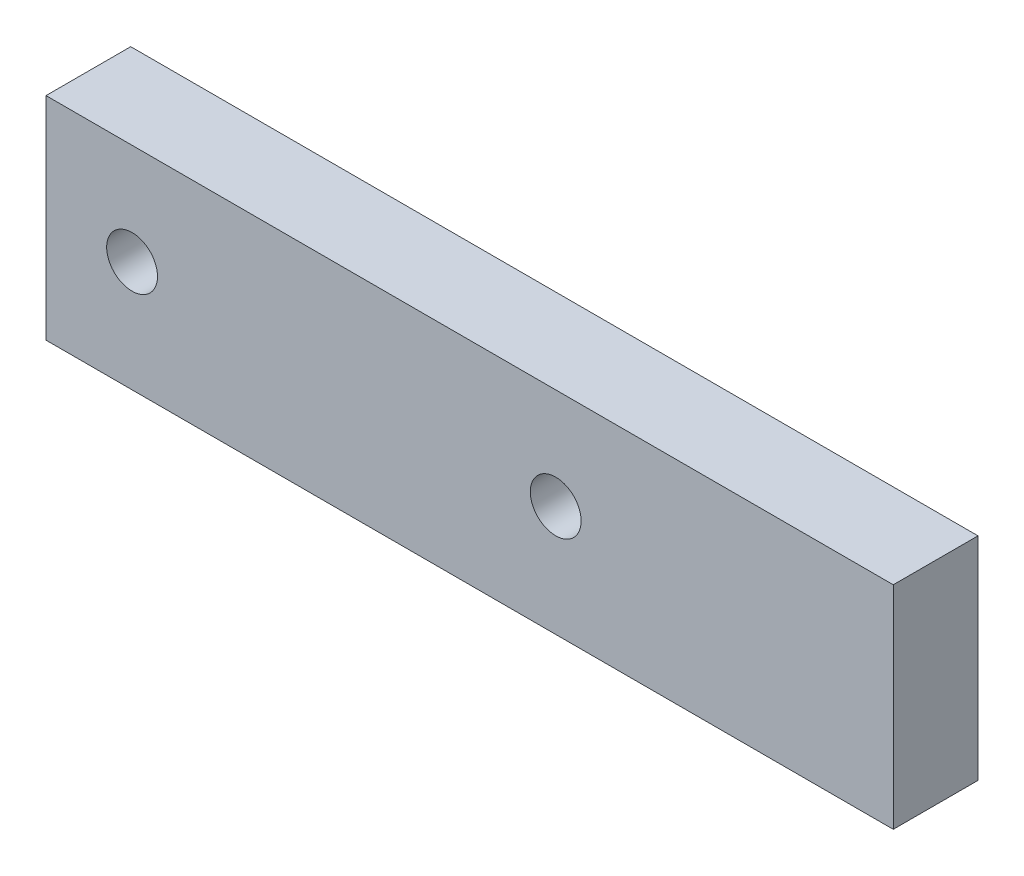
ISO-10303-21;
HEADER;
FILE_DESCRIPTION(('STEP AP214'),'2;1');
FILE_NAME('part.step','',(''),(''),'','','');
FILE_SCHEMA(('AUTOMOTIVE_DESIGN { 1 0 10303 214 1 1 1 1 }'));
ENDSEC;
DATA;
#1=APPLICATION_CONTEXT('core data for automotive mechanical design processes');
#2=APPLICATION_PROTOCOL_DEFINITION('international standard','automotive_design',2000,#1);
#3=PRODUCT_CONTEXT('',#1,'mechanical');
#4=PRODUCT('Part','Part','',(#3));
#5=PRODUCT_RELATED_PRODUCT_CATEGORY('part','',(#4));
#6=PRODUCT_DEFINITION_FORMATION('','',#4);
#7=PRODUCT_DEFINITION_CONTEXT('part definition',#1,'design');
#8=PRODUCT_DEFINITION('design','',#6,#7);
#9=PRODUCT_DEFINITION_SHAPE('','',#8);
#10=(LENGTH_UNIT() NAMED_UNIT(*) SI_UNIT(.MILLI.,.METRE.));
#11=(NAMED_UNIT(*) PLANE_ANGLE_UNIT() SI_UNIT($,.RADIAN.));
#12=(NAMED_UNIT(*) SI_UNIT($,.STERADIAN.) SOLID_ANGLE_UNIT());
#13=UNCERTAINTY_MEASURE_WITH_UNIT(LENGTH_MEASURE(1.E-05),#10,'distance_accuracy_value','');
#14=(GEOMETRIC_REPRESENTATION_CONTEXT(3) GLOBAL_UNCERTAINTY_ASSIGNED_CONTEXT((#13)) GLOBAL_UNIT_ASSIGNED_CONTEXT((#10,
#11,#12)) REPRESENTATION_CONTEXT('',''));
#15=CARTESIAN_POINT('',(0.,0.,0.));
#16=DIRECTION('',(0.,0.,1.));
#17=DIRECTION('',(1.,0.,0.));
#18=AXIS2_PLACEMENT_3D('',#15,#16,#17);
#19=CARTESIAN_POINT('',(-37.6595744680851,11.9148936170213,10.));
#20=DIRECTION('',(1.,0.,0.));
#21=DIRECTION('',(0.,0.,-1.));
#22=AXIS2_PLACEMENT_3D('',#19,#20,#21);
#23=PLANE('',#22);
#24=DIRECTION('',(0.,-1.,0.));
#25=VECTOR('',#24,1.);
#26=CARTESIAN_POINT('',(-37.6595744680851,11.9148936170213,0.));
#27=LINE('',#26,#25);
#28=CARTESIAN_POINT('',(-37.6595744680851,11.9148936170213,0.));
#29=VERTEX_POINT('',#28);
#30=CARTESIAN_POINT('',(-37.6595744680851,-13.0851063829787,0.));
#31=VERTEX_POINT('',#30);
#32=EDGE_CURVE('E100',#29,#31,#27,.T.);
#33=ORIENTED_EDGE('',*,*,#32,.T.);
#34=DIRECTION('',(0.,0.,-1.));
#35=VECTOR('',#34,1.);
#36=CARTESIAN_POINT('',(-37.6595744680851,-13.0851063829787,10.));
#37=LINE('',#36,#35);
#38=CARTESIAN_POINT('',(-37.6595744680851,-13.0851063829787,10.));
#39=VERTEX_POINT('',#38);
#40=EDGE_CURVE('E11',#39,#31,#37,.T.);
#41=ORIENTED_EDGE('',*,*,#40,.F.);
#42=DIRECTION('',(0.,-1.,0.));
#43=VECTOR('',#42,1.);
#44=CARTESIAN_POINT('',(-37.6595744680851,11.9148936170213,10.));
#45=LINE('',#44,#43);
#46=CARTESIAN_POINT('',(-37.6595744680851,11.9148936170213,10.));
#47=VERTEX_POINT('',#46);
#48=EDGE_CURVE('E88',#47,#39,#45,.T.);
#49=ORIENTED_EDGE('',*,*,#48,.F.);
#50=DIRECTION('',(0.,0.,-1.));
#51=VECTOR('',#50,1.);
#52=CARTESIAN_POINT('',(-37.6595744680851,11.9148936170213,10.));
#53=LINE('',#52,#51);
#54=EDGE_CURVE('E96',#47,#29,#53,.T.);
#55=ORIENTED_EDGE('',*,*,#54,.T.);
#56=EDGE_LOOP('',(#33,#41,#49,#55));
#57=FACE_BOUND('',#56,.T.);
#58=ADVANCED_FACE('F37',(#57),#23,.F.);
#59=CARTESIAN_POINT('',(-37.6595744680851,-13.0851063829787,10.));
#60=DIRECTION('',(0.,1.,0.));
#61=DIRECTION('',(0.,0.,1.));
#62=AXIS2_PLACEMENT_3D('',#59,#60,#61);
#63=PLANE('',#62);
#64=DIRECTION('',(1.,0.,0.));
#65=VECTOR('',#64,1.);
#66=CARTESIAN_POINT('',(-37.6595744680851,-13.0851063829787,0.));
#67=LINE('',#66,#65);
#68=CARTESIAN_POINT('',(62.3404255319149,-13.0851063829787,0.));
#69=VERTEX_POINT('',#68);
#70=EDGE_CURVE('E92',#31,#69,#67,.T.);
#71=ORIENTED_EDGE('',*,*,#70,.T.);
#72=DIRECTION('',(0.,0.,-1.));
#73=VECTOR('',#72,1.);
#74=CARTESIAN_POINT('',(62.3404255319149,-13.0851063829787,10.));
#75=LINE('',#74,#73);
#76=CARTESIAN_POINT('',(62.3404255319149,-13.0851063829787,10.));
#77=VERTEX_POINT('',#76);
#78=EDGE_CURVE('E45',#77,#69,#75,.T.);
#79=ORIENTED_EDGE('',*,*,#78,.F.);
#80=DIRECTION('',(1.,0.,0.));
#81=VECTOR('',#80,1.);
#82=CARTESIAN_POINT('',(-37.6595744680851,-13.0851063829787,10.));
#83=LINE('',#82,#81);
#84=EDGE_CURVE('E83',#39,#77,#83,.T.);
#85=ORIENTED_EDGE('',*,*,#84,.F.);
#86=ORIENTED_EDGE('',*,*,#40,.T.);
#87=EDGE_LOOP('',(#71,#79,#85,#86));
#88=FACE_BOUND('',#87,.T.);
#89=ADVANCED_FACE('F91',(#88),#63,.F.);
#90=CARTESIAN_POINT('',(62.3404255319149,11.9148936170213,10.));
#91=DIRECTION('',(-1.,0.,0.));
#92=DIRECTION('',(0.,0.,1.));
#93=AXIS2_PLACEMENT_3D('',#90,#91,#92);
#94=PLANE('',#93);
#95=DIRECTION('',(0.,1.,0.));
#96=VECTOR('',#95,1.);
#97=CARTESIAN_POINT('',(62.3404255319149,11.9148936170213,0.));
#98=LINE('',#97,#96);
#99=CARTESIAN_POINT('',(62.3404255319149,11.9148936170213,0.));
#100=VERTEX_POINT('',#99);
#101=EDGE_CURVE('E70',#69,#100,#98,.T.);
#102=ORIENTED_EDGE('',*,*,#101,.T.);
#103=DIRECTION('',(0.,0.,-1.));
#104=VECTOR('',#103,1.);
#105=CARTESIAN_POINT('',(62.3404255319149,11.9148936170213,10.));
#106=LINE('',#105,#104);
#107=CARTESIAN_POINT('',(62.3404255319149,11.9148936170213,10.));
#108=VERTEX_POINT('',#107);
#109=EDGE_CURVE('E93',#108,#100,#106,.T.);
#110=ORIENTED_EDGE('',*,*,#109,.F.);
#111=DIRECTION('',(0.,1.,0.));
#112=VECTOR('',#111,1.);
#113=CARTESIAN_POINT('',(62.3404255319149,11.9148936170213,10.));
#114=LINE('',#113,#112);
#115=EDGE_CURVE('E86',#77,#108,#114,.T.);
#116=ORIENTED_EDGE('',*,*,#115,.F.);
#117=ORIENTED_EDGE('',*,*,#78,.T.);
#118=EDGE_LOOP('',(#102,#110,#116,#117));
#119=FACE_BOUND('',#118,.T.);
#120=ADVANCED_FACE('F94',(#119),#94,.F.);
#121=CARTESIAN_POINT('',(-37.6595744680851,11.9148936170213,10.));
#122=DIRECTION('',(0.,-1.,0.));
#123=DIRECTION('',(0.,0.,-1.));
#124=AXIS2_PLACEMENT_3D('',#121,#122,#123);
#125=PLANE('',#124);
#126=DIRECTION('',(-1.,0.,0.));
#127=VECTOR('',#126,1.);
#128=CARTESIAN_POINT('',(-37.6595744680851,11.9148936170213,0.));
#129=LINE('',#128,#127);
#130=EDGE_CURVE('E76',#100,#29,#129,.T.);
#131=ORIENTED_EDGE('',*,*,#130,.T.);
#132=ORIENTED_EDGE('',*,*,#54,.F.);
#133=DIRECTION('',(-1.,0.,0.));
#134=VECTOR('',#133,1.);
#135=CARTESIAN_POINT('',(-37.6595744680851,11.9148936170213,10.));
#136=LINE('',#135,#134);
#137=EDGE_CURVE('E53',#108,#47,#136,.T.);
#138=ORIENTED_EDGE('',*,*,#137,.F.);
#139=ORIENTED_EDGE('',*,*,#109,.T.);
#140=EDGE_LOOP('',(#131,#132,#138,#139));
#141=FACE_BOUND('',#140,.T.);
#142=ADVANCED_FACE('F108',(#141),#125,.F.);
#143=CARTESIAN_POINT('',(0.,0.,10.));
#144=DIRECTION('',(0.,0.,1.));
#145=DIRECTION('',(1.,0.,0.));
#146=AXIS2_PLACEMENT_3D('',#143,#144,#145);
#147=PLANE('',#146);
#148=CARTESIAN_POINT('',(22.4995853148409,0.,10.));
#149=DIRECTION('',(0.,0.,1.));
#150=DIRECTION('',(1.,0.,0.));
#151=AXIS2_PLACEMENT_3D('',#148,#149,#150);
#152=CIRCLE('',#151,3.);
#153=CARTESIAN_POINT('',(25.4995853148409,0.,10.));
#154=VERTEX_POINT('',#153);
#155=EDGE_CURVE('E120',#154,#154,#152,.T.);
#156=ORIENTED_EDGE('',*,*,#155,.F.);
#157=EDGE_LOOP('',(#156));
#158=FACE_BOUND('',#157,.T.);
#159=CARTESIAN_POINT('',(-27.5004146851591,0.,10.));
#160=DIRECTION('',(0.,0.,1.));
#161=DIRECTION('',(1.,0.,0.));
#162=AXIS2_PLACEMENT_3D('',#159,#160,#161);
#163=CIRCLE('',#162,3.);
#164=CARTESIAN_POINT('',(-24.5004146851591,0.,10.));
#165=VERTEX_POINT('',#164);
#166=EDGE_CURVE('E114',#165,#165,#163,.T.);
#167=ORIENTED_EDGE('',*,*,#166,.F.);
#168=EDGE_LOOP('',(#167));
#169=FACE_BOUND('',#168,.T.);
#170=ORIENTED_EDGE('',*,*,#48,.T.);
#171=ORIENTED_EDGE('',*,*,#84,.T.);
#172=ORIENTED_EDGE('',*,*,#115,.T.);
#173=ORIENTED_EDGE('',*,*,#137,.T.);
#174=EDGE_LOOP('',(#170,#171,#172,#173));
#175=FACE_BOUND('',#174,.T.);
#176=ADVANCED_FACE('F84',(#158,#169,#175),#147,.T.);
#177=CARTESIAN_POINT('',(0.,0.,0.));
#178=DIRECTION('',(0.,0.,1.));
#179=DIRECTION('',(1.,0.,0.));
#180=AXIS2_PLACEMENT_3D('',#177,#178,#179);
#181=PLANE('',#180);
#182=CARTESIAN_POINT('',(22.4995853148409,0.,0.));
#183=DIRECTION('',(0.,0.,1.));
#184=DIRECTION('',(1.,0.,0.));
#185=AXIS2_PLACEMENT_3D('',#182,#183,#184);
#186=CIRCLE('',#185,3.);
#187=CARTESIAN_POINT('',(25.4995853148409,0.,0.));
#188=VERTEX_POINT('',#187);
#189=EDGE_CURVE('E117',#188,#188,#186,.T.);
#190=ORIENTED_EDGE('',*,*,#189,.T.);
#191=EDGE_LOOP('',(#190));
#192=FACE_BOUND('',#191,.T.);
#193=CARTESIAN_POINT('',(-27.5004146851591,0.,0.));
#194=DIRECTION('',(0.,0.,1.));
#195=DIRECTION('',(1.,0.,0.));
#196=AXIS2_PLACEMENT_3D('',#193,#194,#195);
#197=CIRCLE('',#196,3.);
#198=CARTESIAN_POINT('',(-24.5004146851591,0.,0.));
#199=VERTEX_POINT('',#198);
#200=EDGE_CURVE('E103',#199,#199,#197,.T.);
#201=ORIENTED_EDGE('',*,*,#200,.T.);
#202=EDGE_LOOP('',(#201));
#203=FACE_BOUND('',#202,.T.);
#204=ORIENTED_EDGE('',*,*,#32,.F.);
#205=ORIENTED_EDGE('',*,*,#130,.F.);
#206=ORIENTED_EDGE('',*,*,#101,.F.);
#207=ORIENTED_EDGE('',*,*,#70,.F.);
#208=EDGE_LOOP('',(#204,#205,#206,#207));
#209=FACE_BOUND('',#208,.T.);
#210=ADVANCED_FACE('F111',(#192,#203,#209),#181,.F.);
#211=CARTESIAN_POINT('',(-27.5004146851591,0.,0.));
#212=DIRECTION('',(0.,0.,1.));
#213=DIRECTION('',(1.,0.,0.));
#214=AXIS2_PLACEMENT_3D('',#211,#212,#213);
#215=CYLINDRICAL_SURFACE('',#214,3.);
#216=ORIENTED_EDGE('',*,*,#200,.F.);
#217=EDGE_LOOP('',(#216));
#218=FACE_BOUND('',#217,.T.);
#219=ORIENTED_EDGE('',*,*,#166,.T.);
#220=EDGE_LOOP('',(#219));
#221=FACE_BOUND('',#220,.T.);
#222=ADVANCED_FACE('F131',(#218,#221),#215,.F.);
#223=CARTESIAN_POINT('',(22.4995853148409,0.,0.));
#224=DIRECTION('',(0.,0.,1.));
#225=DIRECTION('',(1.,0.,0.));
#226=AXIS2_PLACEMENT_3D('',#223,#224,#225);
#227=CYLINDRICAL_SURFACE('',#226,3.);
#228=ORIENTED_EDGE('',*,*,#189,.F.);
#229=EDGE_LOOP('',(#228));
#230=FACE_BOUND('',#229,.T.);
#231=ORIENTED_EDGE('',*,*,#155,.T.);
#232=EDGE_LOOP('',(#231));
#233=FACE_BOUND('',#232,.T.);
#234=ADVANCED_FACE('F128',(#230,#233),#227,.F.);
#235=CLOSED_SHELL('',(#58,#89,#120,#142,#176,#210,#222,#234));
#236=MANIFOLD_SOLID_BREP('B2',#235);
#237=ADVANCED_BREP_SHAPE_REPRESENTATION('',(#18,#236),#14);
#238=SHAPE_DEFINITION_REPRESENTATION(#9,#237);
ENDSEC;
END-ISO-10303-21;
